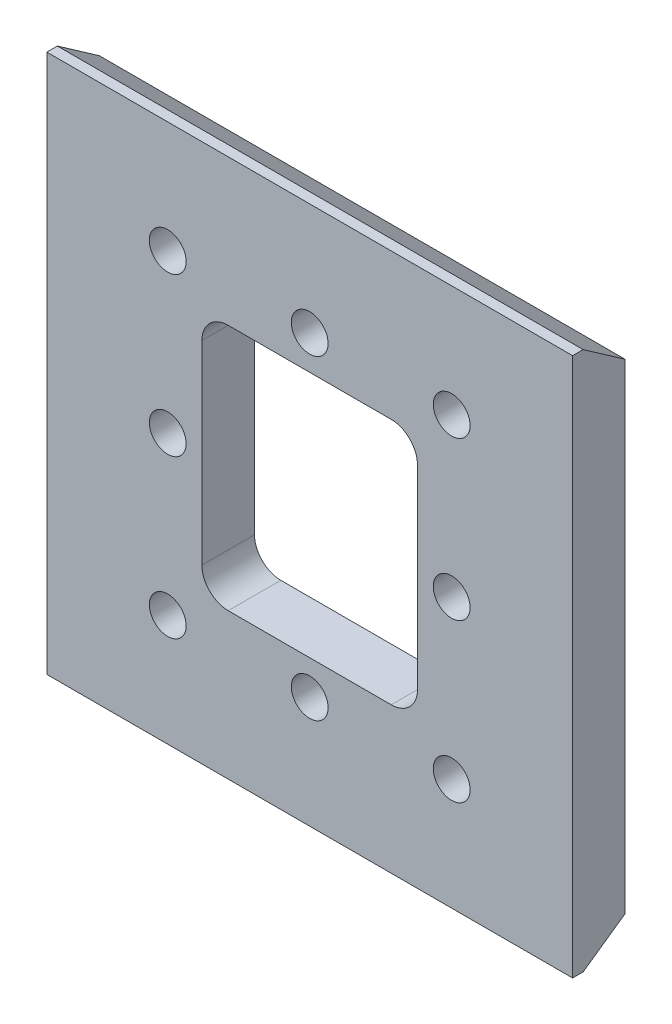
ISO-10303-21;
HEADER;
FILE_DESCRIPTION(('STEP AP214'),'2;1');
FILE_NAME('part.step','',(''),(''),'','','');
FILE_SCHEMA(('AUTOMOTIVE_DESIGN { 1 0 10303 214 1 1 1 1 }'));
ENDSEC;
DATA;
#1=APPLICATION_CONTEXT('core data for automotive mechanical design processes');
#2=APPLICATION_PROTOCOL_DEFINITION('international standard','automotive_design',2000,#1);
#3=PRODUCT_CONTEXT('',#1,'mechanical');
#4=PRODUCT('Part','Part','',(#3));
#5=PRODUCT_RELATED_PRODUCT_CATEGORY('part','',(#4));
#6=PRODUCT_DEFINITION_FORMATION('','',#4);
#7=PRODUCT_DEFINITION_CONTEXT('part definition',#1,'design');
#8=PRODUCT_DEFINITION('design','',#6,#7);
#9=PRODUCT_DEFINITION_SHAPE('','',#8);
#10=(LENGTH_UNIT() NAMED_UNIT(*) SI_UNIT(.MILLI.,.METRE.));
#11=(NAMED_UNIT(*) PLANE_ANGLE_UNIT() SI_UNIT($,.RADIAN.));
#12=(NAMED_UNIT(*) SI_UNIT($,.STERADIAN.) SOLID_ANGLE_UNIT());
#13=UNCERTAINTY_MEASURE_WITH_UNIT(LENGTH_MEASURE(1.E-05),#10,'distance_accuracy_value','');
#14=(GEOMETRIC_REPRESENTATION_CONTEXT(3) GLOBAL_UNCERTAINTY_ASSIGNED_CONTEXT((#13)) GLOBAL_UNIT_ASSIGNED_CONTEXT((#10,
#11,#12)) REPRESENTATION_CONTEXT('',''));
#15=CARTESIAN_POINT('',(0.,0.,0.));
#16=DIRECTION('',(0.,0.,1.));
#17=DIRECTION('',(1.,0.,0.));
#18=AXIS2_PLACEMENT_3D('',#15,#16,#17);
#19=CARTESIAN_POINT('',(100.,102.5,20.));
#20=DIRECTION('',(-1.,0.,0.));
#21=DIRECTION('',(0.,-1.,0.));
#22=AXIS2_PLACEMENT_3D('',#19,#20,#21);
#23=PLANE('',#22);
#24=DIRECTION('',(0.,0.,-1.));
#25=VECTOR('',#24,1.);
#26=CARTESIAN_POINT('',(100.,-102.5,20.));
#27=LINE('',#26,#25);
#28=CARTESIAN_POINT('',(100.,-102.5,20.));
#29=VERTEX_POINT('',#28);
#30=CARTESIAN_POINT('',(100.,-102.5,16.));
#31=VERTEX_POINT('',#30);
#32=EDGE_CURVE('E146',#29,#31,#27,.T.);
#33=ORIENTED_EDGE('',*,*,#32,.T.);
#34=DIRECTION('',(0.,0.573576436351042,-0.819152044288995));
#35=VECTOR('',#34,1.);
#36=CARTESIAN_POINT('',(100.,-102.5,16.));
#37=LINE('',#36,#35);
#38=CARTESIAN_POINT('',(100.,-91.2966793886447,0.));
#39=VERTEX_POINT('',#38);
#40=EDGE_CURVE('E134',#31,#39,#37,.T.);
#41=ORIENTED_EDGE('',*,*,#40,.T.);
#42=DIRECTION('',(0.,1.,0.));
#43=VECTOR('',#42,1.);
#44=CARTESIAN_POINT('',(100.,102.5,0.));
#45=LINE('',#44,#43);
#46=CARTESIAN_POINT('',(100.,91.2966793886448,0.));
#47=VERTEX_POINT('',#46);
#48=EDGE_CURVE('E57',#39,#47,#45,.T.);
#49=ORIENTED_EDGE('',*,*,#48,.T.);
#50=DIRECTION('',(0.,0.573576436351042,0.819152044288995));
#51=VECTOR('',#50,1.);
#52=CARTESIAN_POINT('',(100.,91.2966793886448,0.));
#53=LINE('',#52,#51);
#54=CARTESIAN_POINT('',(100.,102.5,16.));
#55=VERTEX_POINT('',#54);
#56=EDGE_CURVE('E183',#47,#55,#53,.T.);
#57=ORIENTED_EDGE('',*,*,#56,.T.);
#58=DIRECTION('',(0.,0.,-1.));
#59=VECTOR('',#58,1.);
#60=CARTESIAN_POINT('',(100.,102.5,20.));
#61=LINE('',#60,#59);
#62=CARTESIAN_POINT('',(100.,102.5,20.));
#63=VERTEX_POINT('',#62);
#64=EDGE_CURVE('E11',#63,#55,#61,.T.);
#65=ORIENTED_EDGE('',*,*,#64,.F.);
#66=DIRECTION('',(0.,1.,0.));
#67=VECTOR('',#66,1.);
#68=CARTESIAN_POINT('',(100.,102.5,20.));
#69=LINE('',#68,#67);
#70=EDGE_CURVE('E153',#29,#63,#69,.T.);
#71=ORIENTED_EDGE('',*,*,#70,.F.);
#72=EDGE_LOOP('',(#33,#41,#49,#57,#65,#71));
#73=FACE_BOUND('',#72,.T.);
#74=ADVANCED_FACE('F35',(#73),#23,.F.);
#75=CARTESIAN_POINT('',(-100.,102.5,20.));
#76=DIRECTION('',(0.,-1.,0.));
#77=DIRECTION('',(0.,0.,-1.));
#78=AXIS2_PLACEMENT_3D('',#75,#76,#77);
#79=PLANE('',#78);
#80=ORIENTED_EDGE('',*,*,#64,.T.);
#81=DIRECTION('',(-1.,0.,0.));
#82=VECTOR('',#81,1.);
#83=CARTESIAN_POINT('',(100.,102.5,16.));
#84=LINE('',#83,#82);
#85=CARTESIAN_POINT('',(-100.,102.5,16.));
#86=VERTEX_POINT('',#85);
#87=EDGE_CURVE('E175',#55,#86,#84,.T.);
#88=ORIENTED_EDGE('',*,*,#87,.T.);
#89=DIRECTION('',(0.,0.,-1.));
#90=VECTOR('',#89,1.);
#91=CARTESIAN_POINT('',(-100.,102.5,20.));
#92=LINE('',#91,#90);
#93=CARTESIAN_POINT('',(-100.,102.5,20.));
#94=VERTEX_POINT('',#93);
#95=EDGE_CURVE('E42',#94,#86,#92,.T.);
#96=ORIENTED_EDGE('',*,*,#95,.F.);
#97=DIRECTION('',(-1.,0.,0.));
#98=VECTOR('',#97,1.);
#99=CARTESIAN_POINT('',(-100.,102.5,20.));
#100=LINE('',#99,#98);
#101=EDGE_CURVE('E174',#63,#94,#100,.T.);
#102=ORIENTED_EDGE('',*,*,#101,.F.);
#103=EDGE_LOOP('',(#80,#88,#96,#102));
#104=FACE_BOUND('',#103,.T.);
#105=ADVANCED_FACE('F173',(#104),#79,.F.);
#106=CARTESIAN_POINT('',(-100.,102.5,20.));
#107=DIRECTION('',(1.,0.,0.));
#108=DIRECTION('',(0.,1.,0.));
#109=AXIS2_PLACEMENT_3D('',#106,#107,#108);
#110=PLANE('',#109);
#111=DIRECTION('',(0.,-1.,0.));
#112=VECTOR('',#111,1.);
#113=CARTESIAN_POINT('',(-100.,102.5,0.));
#114=LINE('',#113,#112);
#115=CARTESIAN_POINT('',(-100.,91.2966793886447,0.));
#116=VERTEX_POINT('',#115);
#117=CARTESIAN_POINT('',(-100.,-91.2966793886447,0.));
#118=VERTEX_POINT('',#117);
#119=EDGE_CURVE('E160',#116,#118,#114,.T.);
#120=ORIENTED_EDGE('',*,*,#119,.T.);
#121=DIRECTION('',(0.,0.573576436351042,-0.819152044288995));
#122=VECTOR('',#121,1.);
#123=CARTESIAN_POINT('',(-100.,-102.5,16.));
#124=LINE('',#123,#122);
#125=CARTESIAN_POINT('',(-100.,-102.5,16.));
#126=VERTEX_POINT('',#125);
#127=EDGE_CURVE('E49',#126,#118,#124,.T.);
#128=ORIENTED_EDGE('',*,*,#127,.F.);
#129=DIRECTION('',(0.,0.,-1.));
#130=VECTOR('',#129,1.);
#131=CARTESIAN_POINT('',(-100.,-102.5,20.));
#132=LINE('',#131,#130);
#133=CARTESIAN_POINT('',(-100.,-102.5,20.));
#134=VERTEX_POINT('',#133);
#135=EDGE_CURVE('E149',#134,#126,#132,.T.);
#136=ORIENTED_EDGE('',*,*,#135,.F.);
#137=DIRECTION('',(0.,-1.,0.));
#138=VECTOR('',#137,1.);
#139=CARTESIAN_POINT('',(-100.,102.5,20.));
#140=LINE('',#139,#138);
#141=EDGE_CURVE('E157',#94,#134,#140,.T.);
#142=ORIENTED_EDGE('',*,*,#141,.F.);
#143=ORIENTED_EDGE('',*,*,#95,.T.);
#144=DIRECTION('',(0.,0.573576436351042,0.819152044288995));
#145=VECTOR('',#144,1.);
#146=CARTESIAN_POINT('',(-100.,91.2966793886447,0.));
#147=LINE('',#146,#145);
#148=EDGE_CURVE('E169',#116,#86,#147,.T.);
#149=ORIENTED_EDGE('',*,*,#148,.F.);
#150=EDGE_LOOP('',(#120,#128,#136,#142,#143,#149));
#151=FACE_BOUND('',#150,.T.);
#152=ADVANCED_FACE('F168',(#151),#110,.F.);
#153=CARTESIAN_POINT('',(-100.,-102.5,20.));
#154=DIRECTION('',(0.,1.,0.));
#155=DIRECTION('',(0.,0.,1.));
#156=AXIS2_PLACEMENT_3D('',#153,#154,#155);
#157=PLANE('',#156);
#158=ORIENTED_EDGE('',*,*,#135,.T.);
#159=DIRECTION('',(-1.,0.,0.));
#160=VECTOR('',#159,1.);
#161=CARTESIAN_POINT('',(100.,-102.5,16.));
#162=LINE('',#161,#160);
#163=EDGE_CURVE('E137',#31,#126,#162,.T.);
#164=ORIENTED_EDGE('',*,*,#163,.F.);
#165=ORIENTED_EDGE('',*,*,#32,.F.);
#166=DIRECTION('',(1.,0.,0.));
#167=VECTOR('',#166,1.);
#168=CARTESIAN_POINT('',(-100.,-102.5,20.));
#169=LINE('',#168,#167);
#170=EDGE_CURVE('E154',#134,#29,#169,.T.);
#171=ORIENTED_EDGE('',*,*,#170,.F.);
#172=EDGE_LOOP('',(#158,#164,#165,#171));
#173=FACE_BOUND('',#172,.T.);
#174=ADVANCED_FACE('F144',(#173),#157,.F.);
#175=CARTESIAN_POINT('',(0.,0.,20.));
#176=DIRECTION('',(0.,0.,1.));
#177=DIRECTION('',(1.,0.,0.));
#178=AXIS2_PLACEMENT_3D('',#175,#176,#177);
#179=PLANE('',#178);
#180=CARTESIAN_POINT('',(54.,60.,20.));
#181=DIRECTION('',(0.,0.,1.));
#182=DIRECTION('',(-1.,0.,0.));
#183=AXIS2_PLACEMENT_3D('',#180,#181,#182);
#184=CIRCLE('',#183,7.);
#185=CARTESIAN_POINT('',(47.,60.,20.));
#186=VERTEX_POINT('',#185);
#187=EDGE_CURVE('E201',#186,#186,#184,.T.);
#188=ORIENTED_EDGE('',*,*,#187,.F.);
#189=EDGE_LOOP('',(#188));
#190=FACE_BOUND('',#189,.T.);
#191=CARTESIAN_POINT('',(-54.,-60.,20.));
#192=DIRECTION('',(0.,0.,1.));
#193=DIRECTION('',(-1.,0.,0.));
#194=AXIS2_PLACEMENT_3D('',#191,#192,#193);
#195=CIRCLE('',#194,7.);
#196=CARTESIAN_POINT('',(-61.,-60.,20.));
#197=VERTEX_POINT('',#196);
#198=EDGE_CURVE('E191',#197,#197,#195,.T.);
#199=ORIENTED_EDGE('',*,*,#198,.F.);
#200=EDGE_LOOP('',(#199));
#201=FACE_BOUND('',#200,.T.);
#202=CARTESIAN_POINT('',(0.,-60.,20.));
#203=DIRECTION('',(0.,0.,1.));
#204=DIRECTION('',(-1.,0.,0.));
#205=AXIS2_PLACEMENT_3D('',#202,#203,#204);
#206=CIRCLE('',#205,7.);
#207=CARTESIAN_POINT('',(-7.,-60.,20.));
#208=VERTEX_POINT('',#207);
#209=EDGE_CURVE('E192',#208,#208,#206,.T.);
#210=ORIENTED_EDGE('',*,*,#209,.F.);
#211=EDGE_LOOP('',(#210));
#212=FACE_BOUND('',#211,.T.);
#213=CARTESIAN_POINT('',(54.,-60.,20.));
#214=DIRECTION('',(0.,0.,1.));
#215=DIRECTION('',(1.,0.,0.));
#216=AXIS2_PLACEMENT_3D('',#213,#214,#215);
#217=CIRCLE('',#216,7.);
#218=CARTESIAN_POINT('',(61.,-60.,20.));
#219=VERTEX_POINT('',#218);
#220=EDGE_CURVE('E177',#219,#219,#217,.T.);
#221=ORIENTED_EDGE('',*,*,#220,.F.);
#222=EDGE_LOOP('',(#221));
#223=FACE_BOUND('',#222,.T.);
#224=CARTESIAN_POINT('',(0.,60.,20.));
#225=DIRECTION('',(0.,0.,1.));
#226=DIRECTION('',(1.,0.,0.));
#227=AXIS2_PLACEMENT_3D('',#224,#225,#226);
#228=CIRCLE('',#227,7.);
#229=CARTESIAN_POINT('',(7.,60.,20.));
#230=VERTEX_POINT('',#229);
#231=EDGE_CURVE('E225',#230,#230,#228,.T.);
#232=ORIENTED_EDGE('',*,*,#231,.F.);
#233=EDGE_LOOP('',(#232));
#234=FACE_BOUND('',#233,.T.);
#235=CARTESIAN_POINT('',(-31.,-37.,20.));
#236=DIRECTION('',(0.,0.,1.));
#237=DIRECTION('',(1.,0.,0.));
#238=AXIS2_PLACEMENT_3D('',#235,#236,#237);
#239=CIRCLE('',#238,10.);
#240=CARTESIAN_POINT('',(-41.,-36.9999999999999,20.));
#241=VERTEX_POINT('',#240);
#242=CARTESIAN_POINT('',(-30.9999999999999,-47.,20.));
#243=VERTEX_POINT('',#242);
#244=EDGE_CURVE('E212',#241,#243,#239,.T.);
#245=ORIENTED_EDGE('',*,*,#244,.F.);
#246=DIRECTION('',(0.,-1.,0.));
#247=VECTOR('',#246,1.);
#248=CARTESIAN_POINT('',(-41.,36.9999999999999,20.));
#249=LINE('',#248,#247);
#250=CARTESIAN_POINT('',(-41.,36.9999999999999,20.));
#251=VERTEX_POINT('',#250);
#252=EDGE_CURVE('E233',#251,#241,#249,.T.);
#253=ORIENTED_EDGE('',*,*,#252,.F.);
#254=CARTESIAN_POINT('',(-31.,37.,20.));
#255=DIRECTION('',(0.,0.,1.));
#256=DIRECTION('',(1.,0.,0.));
#257=AXIS2_PLACEMENT_3D('',#254,#255,#256);
#258=CIRCLE('',#257,10.);
#259=CARTESIAN_POINT('',(-30.9999999999999,47.,20.));
#260=VERTEX_POINT('',#259);
#261=EDGE_CURVE('E271',#260,#251,#258,.T.);
#262=ORIENTED_EDGE('',*,*,#261,.F.);
#263=DIRECTION('',(-1.,0.,0.));
#264=VECTOR('',#263,1.);
#265=CARTESIAN_POINT('',(-30.9999999999999,47.,20.));
#266=LINE('',#265,#264);
#267=CARTESIAN_POINT('',(30.9999999999999,47.,20.));
#268=VERTEX_POINT('',#267);
#269=EDGE_CURVE('E268',#268,#260,#266,.T.);
#270=ORIENTED_EDGE('',*,*,#269,.F.);
#271=CARTESIAN_POINT('',(31.,37.,20.));
#272=DIRECTION('',(0.,0.,1.));
#273=DIRECTION('',(-1.,0.,0.));
#274=AXIS2_PLACEMENT_3D('',#271,#272,#273);
#275=CIRCLE('',#274,10.);
#276=CARTESIAN_POINT('',(41.,36.9999999999999,20.));
#277=VERTEX_POINT('',#276);
#278=EDGE_CURVE('E265',#277,#268,#275,.T.);
#279=ORIENTED_EDGE('',*,*,#278,.F.);
#280=DIRECTION('',(0.,1.,0.));
#281=VECTOR('',#280,1.);
#282=CARTESIAN_POINT('',(41.,36.9999999999999,20.));
#283=LINE('',#282,#281);
#284=CARTESIAN_POINT('',(41.,-36.9999999999999,20.));
#285=VERTEX_POINT('',#284);
#286=EDGE_CURVE('E262',#285,#277,#283,.T.);
#287=ORIENTED_EDGE('',*,*,#286,.F.);
#288=CARTESIAN_POINT('',(31.,-37.,20.));
#289=DIRECTION('',(0.,0.,1.));
#290=DIRECTION('',(1.,0.,0.));
#291=AXIS2_PLACEMENT_3D('',#288,#289,#290);
#292=CIRCLE('',#291,10.);
#293=CARTESIAN_POINT('',(30.9999999999999,-47.,20.));
#294=VERTEX_POINT('',#293);
#295=EDGE_CURVE('E259',#294,#285,#292,.T.);
#296=ORIENTED_EDGE('',*,*,#295,.F.);
#297=DIRECTION('',(1.,0.,0.));
#298=VECTOR('',#297,1.);
#299=CARTESIAN_POINT('',(-30.9999999999999,-47.,20.));
#300=LINE('',#299,#298);
#301=EDGE_CURVE('E256',#243,#294,#300,.T.);
#302=ORIENTED_EDGE('',*,*,#301,.F.);
#303=EDGE_LOOP('',(#245,#253,#262,#270,#279,#287,#296,#302));
#304=FACE_BOUND('',#303,.T.);
#305=CARTESIAN_POINT('',(-54.,0.,20.));
#306=DIRECTION('',(0.,0.,1.));
#307=DIRECTION('',(1.,0.,0.));
#308=AXIS2_PLACEMENT_3D('',#305,#306,#307);
#309=CIRCLE('',#308,7.);
#310=CARTESIAN_POINT('',(-47.,0.,20.));
#311=VERTEX_POINT('',#310);
#312=EDGE_CURVE('E213',#311,#311,#309,.T.);
#313=ORIENTED_EDGE('',*,*,#312,.F.);
#314=EDGE_LOOP('',(#313));
#315=FACE_BOUND('',#314,.T.);
#316=CARTESIAN_POINT('',(54.,0.,20.));
#317=DIRECTION('',(0.,0.,1.));
#318=DIRECTION('',(-1.,0.,0.));
#319=AXIS2_PLACEMENT_3D('',#316,#317,#318);
#320=CIRCLE('',#319,7.);
#321=CARTESIAN_POINT('',(47.,0.,20.));
#322=VERTEX_POINT('',#321);
#323=EDGE_CURVE('E200',#322,#322,#320,.T.);
#324=ORIENTED_EDGE('',*,*,#323,.F.);
#325=EDGE_LOOP('',(#324));
#326=FACE_BOUND('',#325,.T.);
#327=CARTESIAN_POINT('',(-54.,60.,20.));
#328=DIRECTION('',(0.,0.,1.));
#329=DIRECTION('',(1.,0.,0.));
#330=AXIS2_PLACEMENT_3D('',#327,#328,#329);
#331=CIRCLE('',#330,7.);
#332=CARTESIAN_POINT('',(-47.,60.,20.));
#333=VERTEX_POINT('',#332);
#334=EDGE_CURVE('E224',#333,#333,#331,.T.);
#335=ORIENTED_EDGE('',*,*,#334,.F.);
#336=EDGE_LOOP('',(#335));
#337=FACE_BOUND('',#336,.T.);
#338=ORIENTED_EDGE('',*,*,#70,.T.);
#339=ORIENTED_EDGE('',*,*,#101,.T.);
#340=ORIENTED_EDGE('',*,*,#141,.T.);
#341=ORIENTED_EDGE('',*,*,#170,.T.);
#342=EDGE_LOOP('',(#338,#339,#340,#341));
#343=FACE_BOUND('',#342,.T.);
#344=ADVANCED_FACE('F327',(#190,#201,#212,#223,#234,#304,#315,#326,#337,#343),#179,.T.);
#345=CARTESIAN_POINT('',(0.,0.,0.));
#346=DIRECTION('',(0.,0.,1.));
#347=DIRECTION('',(1.,0.,0.));
#348=AXIS2_PLACEMENT_3D('',#345,#346,#347);
#349=PLANE('',#348);
#350=CARTESIAN_POINT('',(54.,60.,0.));
#351=DIRECTION('',(0.,0.,1.));
#352=DIRECTION('',(-1.,0.,0.));
#353=AXIS2_PLACEMENT_3D('',#350,#351,#352);
#354=CIRCLE('',#353,7.);
#355=CARTESIAN_POINT('',(47.,60.,0.));
#356=VERTEX_POINT('',#355);
#357=EDGE_CURVE('E197',#356,#356,#354,.T.);
#358=ORIENTED_EDGE('',*,*,#357,.T.);
#359=EDGE_LOOP('',(#358));
#360=FACE_BOUND('',#359,.T.);
#361=CARTESIAN_POINT('',(-54.,-60.,0.));
#362=DIRECTION('',(0.,0.,1.));
#363=DIRECTION('',(-1.,0.,0.));
#364=AXIS2_PLACEMENT_3D('',#361,#362,#363);
#365=CIRCLE('',#364,7.);
#366=CARTESIAN_POINT('',(-61.,-60.,0.));
#367=VERTEX_POINT('',#366);
#368=EDGE_CURVE('E204',#367,#367,#365,.T.);
#369=ORIENTED_EDGE('',*,*,#368,.T.);
#370=EDGE_LOOP('',(#369));
#371=FACE_BOUND('',#370,.T.);
#372=CARTESIAN_POINT('',(0.,-60.,0.));
#373=DIRECTION('',(0.,0.,1.));
#374=DIRECTION('',(-1.,0.,0.));
#375=AXIS2_PLACEMENT_3D('',#372,#373,#374);
#376=CIRCLE('',#375,7.);
#377=CARTESIAN_POINT('',(-7.,-60.,0.));
#378=VERTEX_POINT('',#377);
#379=EDGE_CURVE('E188',#378,#378,#376,.T.);
#380=ORIENTED_EDGE('',*,*,#379,.T.);
#381=EDGE_LOOP('',(#380));
#382=FACE_BOUND('',#381,.T.);
#383=CARTESIAN_POINT('',(54.,-60.,0.));
#384=DIRECTION('',(0.,0.,1.));
#385=DIRECTION('',(1.,0.,0.));
#386=AXIS2_PLACEMENT_3D('',#383,#384,#385);
#387=CIRCLE('',#386,7.);
#388=CARTESIAN_POINT('',(61.,-60.,0.));
#389=VERTEX_POINT('',#388);
#390=EDGE_CURVE('E181',#389,#389,#387,.T.);
#391=ORIENTED_EDGE('',*,*,#390,.T.);
#392=EDGE_LOOP('',(#391));
#393=FACE_BOUND('',#392,.T.);
#394=CARTESIAN_POINT('',(0.,60.,0.));
#395=DIRECTION('',(0.,0.,1.));
#396=DIRECTION('',(1.,0.,0.));
#397=AXIS2_PLACEMENT_3D('',#394,#395,#396);
#398=CIRCLE('',#397,7.);
#399=CARTESIAN_POINT('',(7.,60.,0.));
#400=VERTEX_POINT('',#399);
#401=EDGE_CURVE('E221',#400,#400,#398,.T.);
#402=ORIENTED_EDGE('',*,*,#401,.T.);
#403=EDGE_LOOP('',(#402));
#404=FACE_BOUND('',#403,.T.);
#405=DIRECTION('',(0.,-1.,0.));
#406=VECTOR('',#405,1.);
#407=CARTESIAN_POINT('',(-41.,36.9999999999999,0.));
#408=LINE('',#407,#406);
#409=CARTESIAN_POINT('',(-41.,36.9999999999999,0.));
#410=VERTEX_POINT('',#409);
#411=CARTESIAN_POINT('',(-41.,-36.9999999999999,0.));
#412=VERTEX_POINT('',#411);
#413=EDGE_CURVE('E251',#410,#412,#408,.T.);
#414=ORIENTED_EDGE('',*,*,#413,.T.);
#415=CARTESIAN_POINT('',(-31.,-37.,0.));
#416=DIRECTION('',(0.,0.,1.));
#417=DIRECTION('',(1.,0.,0.));
#418=AXIS2_PLACEMENT_3D('',#415,#416,#417);
#419=CIRCLE('',#418,10.);
#420=CARTESIAN_POINT('',(-30.9999999999999,-47.,0.));
#421=VERTEX_POINT('',#420);
#422=EDGE_CURVE('E229',#412,#421,#419,.T.);
#423=ORIENTED_EDGE('',*,*,#422,.T.);
#424=DIRECTION('',(1.,0.,0.));
#425=VECTOR('',#424,1.);
#426=CARTESIAN_POINT('',(-30.9999999999999,-47.,0.));
#427=LINE('',#426,#425);
#428=CARTESIAN_POINT('',(30.9999999999999,-47.,0.));
#429=VERTEX_POINT('',#428);
#430=EDGE_CURVE('E232',#421,#429,#427,.T.);
#431=ORIENTED_EDGE('',*,*,#430,.T.);
#432=CARTESIAN_POINT('',(31.,-37.,0.));
#433=DIRECTION('',(0.,0.,1.));
#434=DIRECTION('',(1.,0.,0.));
#435=AXIS2_PLACEMENT_3D('',#432,#433,#434);
#436=CIRCLE('',#435,10.);
#437=CARTESIAN_POINT('',(41.,-36.9999999999999,0.));
#438=VERTEX_POINT('',#437);
#439=EDGE_CURVE('E236',#429,#438,#436,.T.);
#440=ORIENTED_EDGE('',*,*,#439,.T.);
#441=DIRECTION('',(0.,1.,0.));
#442=VECTOR('',#441,1.);
#443=CARTESIAN_POINT('',(41.,36.9999999999999,0.));
#444=LINE('',#443,#442);
#445=CARTESIAN_POINT('',(41.,36.9999999999999,0.));
#446=VERTEX_POINT('',#445);
#447=EDGE_CURVE('E239',#438,#446,#444,.T.);
#448=ORIENTED_EDGE('',*,*,#447,.T.);
#449=CARTESIAN_POINT('',(31.,37.,0.));
#450=DIRECTION('',(0.,0.,1.));
#451=DIRECTION('',(-1.,0.,0.));
#452=AXIS2_PLACEMENT_3D('',#449,#450,#451);
#453=CIRCLE('',#452,10.);
#454=CARTESIAN_POINT('',(30.9999999999999,47.,0.));
#455=VERTEX_POINT('',#454);
#456=EDGE_CURVE('E242',#446,#455,#453,.T.);
#457=ORIENTED_EDGE('',*,*,#456,.T.);
#458=DIRECTION('',(-1.,0.,0.));
#459=VECTOR('',#458,1.);
#460=CARTESIAN_POINT('',(-30.9999999999999,47.,0.));
#461=LINE('',#460,#459);
#462=CARTESIAN_POINT('',(-30.9999999999999,47.,0.));
#463=VERTEX_POINT('',#462);
#464=EDGE_CURVE('E245',#455,#463,#461,.T.);
#465=ORIENTED_EDGE('',*,*,#464,.T.);
#466=CARTESIAN_POINT('',(-31.,37.,0.));
#467=DIRECTION('',(0.,0.,1.));
#468=DIRECTION('',(1.,0.,0.));
#469=AXIS2_PLACEMENT_3D('',#466,#467,#468);
#470=CIRCLE('',#469,10.);
#471=EDGE_CURVE('E248',#463,#410,#470,.T.);
#472=ORIENTED_EDGE('',*,*,#471,.T.);
#473=EDGE_LOOP('',(#414,#423,#431,#440,#448,#457,#465,#472));
#474=FACE_BOUND('',#473,.T.);
#475=CARTESIAN_POINT('',(-54.,0.,0.));
#476=DIRECTION('',(0.,0.,1.));
#477=DIRECTION('',(1.,0.,0.));
#478=AXIS2_PLACEMENT_3D('',#475,#476,#477);
#479=CIRCLE('',#478,7.);
#480=CARTESIAN_POINT('',(-47.,0.,0.));
#481=VERTEX_POINT('',#480);
#482=EDGE_CURVE('E209',#481,#481,#479,.T.);
#483=ORIENTED_EDGE('',*,*,#482,.T.);
#484=EDGE_LOOP('',(#483));
#485=FACE_BOUND('',#484,.T.);
#486=CARTESIAN_POINT('',(54.,0.,0.));
#487=DIRECTION('',(0.,0.,1.));
#488=DIRECTION('',(-1.,0.,0.));
#489=AXIS2_PLACEMENT_3D('',#486,#487,#488);
#490=CIRCLE('',#489,7.);
#491=CARTESIAN_POINT('',(47.,0.,0.));
#492=VERTEX_POINT('',#491);
#493=EDGE_CURVE('E216',#492,#492,#490,.T.);
#494=ORIENTED_EDGE('',*,*,#493,.T.);
#495=EDGE_LOOP('',(#494));
#496=FACE_BOUND('',#495,.T.);
#497=CARTESIAN_POINT('',(-54.,60.,0.));
#498=DIRECTION('',(0.,0.,1.));
#499=DIRECTION('',(1.,0.,0.));
#500=AXIS2_PLACEMENT_3D('',#497,#498,#499);
#501=CIRCLE('',#500,7.);
#502=CARTESIAN_POINT('',(-47.,60.,0.));
#503=VERTEX_POINT('',#502);
#504=EDGE_CURVE('E291',#503,#503,#501,.T.);
#505=ORIENTED_EDGE('',*,*,#504,.T.);
#506=EDGE_LOOP('',(#505));
#507=FACE_BOUND('',#506,.T.);
#508=ORIENTED_EDGE('',*,*,#48,.F.);
#509=DIRECTION('',(-1.,0.,0.));
#510=VECTOR('',#509,1.);
#511=CARTESIAN_POINT('',(100.,-91.2966793886447,0.));
#512=LINE('',#511,#510);
#513=EDGE_CURVE('E138',#39,#118,#512,.T.);
#514=ORIENTED_EDGE('',*,*,#513,.T.);
#515=ORIENTED_EDGE('',*,*,#119,.F.);
#516=DIRECTION('',(-1.,0.,0.));
#517=VECTOR('',#516,1.);
#518=CARTESIAN_POINT('',(100.,91.2966793886448,0.));
#519=LINE('',#518,#517);
#520=EDGE_CURVE('E178',#47,#116,#519,.T.);
#521=ORIENTED_EDGE('',*,*,#520,.F.);
#522=EDGE_LOOP('',(#508,#514,#515,#521));
#523=FACE_BOUND('',#522,.T.);
#524=ADVANCED_FACE('F300',(#360,#371,#382,#393,#404,#474,#485,#496,#507,#523),#349,.F.);
#525=CARTESIAN_POINT('',(-54.,60.,0.));
#526=DIRECTION('',(0.,0.,1.));
#527=DIRECTION('',(1.,0.,0.));
#528=AXIS2_PLACEMENT_3D('',#525,#526,#527);
#529=CYLINDRICAL_SURFACE('',#528,7.);
#530=ORIENTED_EDGE('',*,*,#504,.F.);
#531=EDGE_LOOP('',(#530));
#532=FACE_BOUND('',#531,.T.);
#533=ORIENTED_EDGE('',*,*,#334,.T.);
#534=EDGE_LOOP('',(#533));
#535=FACE_BOUND('',#534,.T.);
#536=ADVANCED_FACE('F330',(#532,#535),#529,.F.);
#537=CARTESIAN_POINT('',(54.,0.,0.));
#538=DIRECTION('',(0.,0.,1.));
#539=DIRECTION('',(1.,0.,0.));
#540=AXIS2_PLACEMENT_3D('',#537,#538,#539);
#541=CYLINDRICAL_SURFACE('',#540,7.);
#542=ORIENTED_EDGE('',*,*,#493,.F.);
#543=EDGE_LOOP('',(#542));
#544=FACE_BOUND('',#543,.T.);
#545=ORIENTED_EDGE('',*,*,#323,.T.);
#546=EDGE_LOOP('',(#545));
#547=FACE_BOUND('',#546,.T.);
#548=ADVANCED_FACE('F337',(#544,#547),#541,.F.);
#549=CARTESIAN_POINT('',(-54.,0.,0.));
#550=DIRECTION('',(0.,0.,1.));
#551=DIRECTION('',(1.,0.,0.));
#552=AXIS2_PLACEMENT_3D('',#549,#550,#551);
#553=CYLINDRICAL_SURFACE('',#552,7.);
#554=ORIENTED_EDGE('',*,*,#482,.F.);
#555=EDGE_LOOP('',(#554));
#556=FACE_BOUND('',#555,.T.);
#557=ORIENTED_EDGE('',*,*,#312,.T.);
#558=EDGE_LOOP('',(#557));
#559=FACE_BOUND('',#558,.T.);
#560=ADVANCED_FACE('F343',(#556,#559),#553,.F.);
#561=CARTESIAN_POINT('',(-31.,-37.,0.));
#562=DIRECTION('',(0.,0.,1.));
#563=DIRECTION('',(1.,0.,0.));
#564=AXIS2_PLACEMENT_3D('',#561,#562,#563);
#565=CYLINDRICAL_SURFACE('',#564,10.);
#566=ORIENTED_EDGE('',*,*,#244,.T.);
#567=DIRECTION('',(0.,0.,1.));
#568=VECTOR('',#567,1.);
#569=CARTESIAN_POINT('',(-30.9999999999999,-47.,0.));
#570=LINE('',#569,#568);
#571=EDGE_CURVE('E254',#421,#243,#570,.T.);
#572=ORIENTED_EDGE('',*,*,#571,.F.);
#573=ORIENTED_EDGE('',*,*,#422,.F.);
#574=DIRECTION('',(0.,0.,1.));
#575=VECTOR('',#574,1.);
#576=CARTESIAN_POINT('',(-41.,-36.9999999999999,0.));
#577=LINE('',#576,#575);
#578=EDGE_CURVE('E228',#412,#241,#577,.T.);
#579=ORIENTED_EDGE('',*,*,#578,.T.);
#580=EDGE_LOOP('',(#566,#572,#573,#579));
#581=FACE_BOUND('',#580,.T.);
#582=ADVANCED_FACE('F339',(#581),#565,.F.);
#583=CARTESIAN_POINT('',(-41.,36.9999999999999,0.));
#584=DIRECTION('',(-1.,0.,0.));
#585=DIRECTION('',(0.,-1.,0.));
#586=AXIS2_PLACEMENT_3D('',#583,#584,#585);
#587=PLANE('',#586);
#588=ORIENTED_EDGE('',*,*,#252,.T.);
#589=ORIENTED_EDGE('',*,*,#578,.F.);
#590=ORIENTED_EDGE('',*,*,#413,.F.);
#591=DIRECTION('',(0.,0.,1.));
#592=VECTOR('',#591,1.);
#593=CARTESIAN_POINT('',(-41.,36.9999999999999,0.));
#594=LINE('',#593,#592);
#595=EDGE_CURVE('E277',#410,#251,#594,.T.);
#596=ORIENTED_EDGE('',*,*,#595,.T.);
#597=EDGE_LOOP('',(#588,#589,#590,#596));
#598=FACE_BOUND('',#597,.T.);
#599=ADVANCED_FACE('F342',(#598),#587,.F.);
#600=CARTESIAN_POINT('',(-31.,37.,0.));
#601=DIRECTION('',(0.,0.,1.));
#602=DIRECTION('',(1.,0.,0.));
#603=AXIS2_PLACEMENT_3D('',#600,#601,#602);
#604=CYLINDRICAL_SURFACE('',#603,10.);
#605=ORIENTED_EDGE('',*,*,#261,.T.);
#606=ORIENTED_EDGE('',*,*,#595,.F.);
#607=ORIENTED_EDGE('',*,*,#471,.F.);
#608=DIRECTION('',(0.,0.,1.));
#609=VECTOR('',#608,1.);
#610=CARTESIAN_POINT('',(-30.9999999999999,47.,0.));
#611=LINE('',#610,#609);
#612=EDGE_CURVE('E279',#463,#260,#611,.T.);
#613=ORIENTED_EDGE('',*,*,#612,.T.);
#614=EDGE_LOOP('',(#605,#606,#607,#613));
#615=FACE_BOUND('',#614,.T.);
#616=ADVANCED_FACE('F365',(#615),#604,.F.);
#617=CARTESIAN_POINT('',(-30.9999999999999,47.,0.));
#618=DIRECTION('',(0.,1.,0.));
#619=DIRECTION('',(0.,0.,1.));
#620=AXIS2_PLACEMENT_3D('',#617,#618,#619);
#621=PLANE('',#620);
#622=ORIENTED_EDGE('',*,*,#269,.T.);
#623=ORIENTED_EDGE('',*,*,#612,.F.);
#624=ORIENTED_EDGE('',*,*,#464,.F.);
#625=DIRECTION('',(0.,0.,1.));
#626=VECTOR('',#625,1.);
#627=CARTESIAN_POINT('',(30.9999999999999,47.,0.));
#628=LINE('',#627,#626);
#629=EDGE_CURVE('E281',#455,#268,#628,.T.);
#630=ORIENTED_EDGE('',*,*,#629,.T.);
#631=EDGE_LOOP('',(#622,#623,#624,#630));
#632=FACE_BOUND('',#631,.T.);
#633=ADVANCED_FACE('F361',(#632),#621,.F.);
#634=CARTESIAN_POINT('',(31.,37.,0.));
#635=DIRECTION('',(0.,0.,1.));
#636=DIRECTION('',(1.,0.,0.));
#637=AXIS2_PLACEMENT_3D('',#634,#635,#636);
#638=CYLINDRICAL_SURFACE('',#637,10.);
#639=ORIENTED_EDGE('',*,*,#278,.T.);
#640=ORIENTED_EDGE('',*,*,#629,.F.);
#641=ORIENTED_EDGE('',*,*,#456,.F.);
#642=DIRECTION('',(0.,0.,1.));
#643=VECTOR('',#642,1.);
#644=CARTESIAN_POINT('',(41.,36.9999999999999,0.));
#645=LINE('',#644,#643);
#646=EDGE_CURVE('E283',#446,#277,#645,.T.);
#647=ORIENTED_EDGE('',*,*,#646,.T.);
#648=EDGE_LOOP('',(#639,#640,#641,#647));
#649=FACE_BOUND('',#648,.T.);
#650=ADVANCED_FACE('F357',(#649),#638,.F.);
#651=CARTESIAN_POINT('',(41.,36.9999999999999,0.));
#652=DIRECTION('',(1.,0.,0.));
#653=DIRECTION('',(0.,1.,0.));
#654=AXIS2_PLACEMENT_3D('',#651,#652,#653);
#655=PLANE('',#654);
#656=ORIENTED_EDGE('',*,*,#286,.T.);
#657=ORIENTED_EDGE('',*,*,#646,.F.);
#658=ORIENTED_EDGE('',*,*,#447,.F.);
#659=DIRECTION('',(0.,0.,1.));
#660=VECTOR('',#659,1.);
#661=CARTESIAN_POINT('',(41.,-36.9999999999999,0.));
#662=LINE('',#661,#660);
#663=EDGE_CURVE('E285',#438,#285,#662,.T.);
#664=ORIENTED_EDGE('',*,*,#663,.T.);
#665=EDGE_LOOP('',(#656,#657,#658,#664));
#666=FACE_BOUND('',#665,.T.);
#667=ADVANCED_FACE('F353',(#666),#655,.F.);
#668=CARTESIAN_POINT('',(31.,-37.,0.));
#669=DIRECTION('',(0.,0.,1.));
#670=DIRECTION('',(1.,0.,0.));
#671=AXIS2_PLACEMENT_3D('',#668,#669,#670);
#672=CYLINDRICAL_SURFACE('',#671,10.);
#673=ORIENTED_EDGE('',*,*,#295,.T.);
#674=ORIENTED_EDGE('',*,*,#663,.F.);
#675=ORIENTED_EDGE('',*,*,#439,.F.);
#676=DIRECTION('',(0.,0.,1.));
#677=VECTOR('',#676,1.);
#678=CARTESIAN_POINT('',(30.9999999999999,-47.,0.));
#679=LINE('',#678,#677);
#680=EDGE_CURVE('E287',#429,#294,#679,.T.);
#681=ORIENTED_EDGE('',*,*,#680,.T.);
#682=EDGE_LOOP('',(#673,#674,#675,#681));
#683=FACE_BOUND('',#682,.T.);
#684=ADVANCED_FACE('F349',(#683),#672,.F.);
#685=CARTESIAN_POINT('',(-30.9999999999999,-47.,0.));
#686=DIRECTION('',(0.,-1.,0.));
#687=DIRECTION('',(0.,0.,-1.));
#688=AXIS2_PLACEMENT_3D('',#685,#686,#687);
#689=PLANE('',#688);
#690=ORIENTED_EDGE('',*,*,#301,.T.);
#691=ORIENTED_EDGE('',*,*,#680,.F.);
#692=ORIENTED_EDGE('',*,*,#430,.F.);
#693=ORIENTED_EDGE('',*,*,#571,.T.);
#694=EDGE_LOOP('',(#690,#691,#692,#693));
#695=FACE_BOUND('',#694,.T.);
#696=ADVANCED_FACE('F345',(#695),#689,.F.);
#697=CARTESIAN_POINT('',(0.,60.,0.));
#698=DIRECTION('',(0.,0.,1.));
#699=DIRECTION('',(1.,0.,0.));
#700=AXIS2_PLACEMENT_3D('',#697,#698,#699);
#701=CYLINDRICAL_SURFACE('',#700,7.);
#702=ORIENTED_EDGE('',*,*,#401,.F.);
#703=EDGE_LOOP('',(#702));
#704=FACE_BOUND('',#703,.T.);
#705=ORIENTED_EDGE('',*,*,#231,.T.);
#706=EDGE_LOOP('',(#705));
#707=FACE_BOUND('',#706,.T.);
#708=ADVANCED_FACE('F348',(#704,#707),#701,.F.);
#709=CARTESIAN_POINT('',(54.,-60.,0.));
#710=DIRECTION('',(0.,0.,1.));
#711=DIRECTION('',(1.,0.,0.));
#712=AXIS2_PLACEMENT_3D('',#709,#710,#711);
#713=CYLINDRICAL_SURFACE('',#712,7.);
#714=ORIENTED_EDGE('',*,*,#390,.F.);
#715=EDGE_LOOP('',(#714));
#716=FACE_BOUND('',#715,.T.);
#717=ORIENTED_EDGE('',*,*,#220,.T.);
#718=EDGE_LOOP('',(#717));
#719=FACE_BOUND('',#718,.T.);
#720=ADVANCED_FACE('F375',(#716,#719),#713,.F.);
#721=CARTESIAN_POINT('',(0.,-60.,0.));
#722=DIRECTION('',(0.,0.,1.));
#723=DIRECTION('',(1.,0.,0.));
#724=AXIS2_PLACEMENT_3D('',#721,#722,#723);
#725=CYLINDRICAL_SURFACE('',#724,7.);
#726=ORIENTED_EDGE('',*,*,#379,.F.);
#727=EDGE_LOOP('',(#726));
#728=FACE_BOUND('',#727,.T.);
#729=ORIENTED_EDGE('',*,*,#209,.T.);
#730=EDGE_LOOP('',(#729));
#731=FACE_BOUND('',#730,.T.);
#732=ADVANCED_FACE('F384',(#728,#731),#725,.F.);
#733=CARTESIAN_POINT('',(-54.,-60.,0.));
#734=DIRECTION('',(0.,0.,1.));
#735=DIRECTION('',(1.,0.,0.));
#736=AXIS2_PLACEMENT_3D('',#733,#734,#735);
#737=CYLINDRICAL_SURFACE('',#736,7.);
#738=ORIENTED_EDGE('',*,*,#368,.F.);
#739=EDGE_LOOP('',(#738));
#740=FACE_BOUND('',#739,.T.);
#741=ORIENTED_EDGE('',*,*,#198,.T.);
#742=EDGE_LOOP('',(#741));
#743=FACE_BOUND('',#742,.T.);
#744=ADVANCED_FACE('F312',(#740,#743),#737,.F.);
#745=CARTESIAN_POINT('',(54.,60.,0.));
#746=DIRECTION('',(0.,0.,1.));
#747=DIRECTION('',(1.,0.,0.));
#748=AXIS2_PLACEMENT_3D('',#745,#746,#747);
#749=CYLINDRICAL_SURFACE('',#748,7.);
#750=ORIENTED_EDGE('',*,*,#357,.F.);
#751=EDGE_LOOP('',(#750));
#752=FACE_BOUND('',#751,.T.);
#753=ORIENTED_EDGE('',*,*,#187,.T.);
#754=EDGE_LOOP('',(#753));
#755=FACE_BOUND('',#754,.T.);
#756=ADVANCED_FACE('F305',(#752,#755),#749,.F.);
#757=CARTESIAN_POINT('',(100.,91.2966793886448,0.));
#758=DIRECTION('',(0.,-0.819152044288995,0.573576436351042));
#759=DIRECTION('',(0.,-0.573576436351042,-0.819152044288995));
#760=AXIS2_PLACEMENT_3D('',#757,#758,#759);
#761=PLANE('',#760);
#762=ORIENTED_EDGE('',*,*,#148,.T.);
#763=ORIENTED_EDGE('',*,*,#87,.F.);
#764=ORIENTED_EDGE('',*,*,#56,.F.);
#765=ORIENTED_EDGE('',*,*,#520,.T.);
#766=EDGE_LOOP('',(#762,#763,#764,#765));
#767=FACE_BOUND('',#766,.T.);
#768=ADVANCED_FACE('F303',(#767),#761,.F.);
#769=CARTESIAN_POINT('',(100.,-102.5,16.));
#770=DIRECTION('',(0.,0.819152044288995,0.573576436351042));
#771=DIRECTION('',(0.,-0.573576436351042,0.819152044288995));
#772=AXIS2_PLACEMENT_3D('',#769,#770,#771);
#773=PLANE('',#772);
#774=ORIENTED_EDGE('',*,*,#127,.T.);
#775=ORIENTED_EDGE('',*,*,#513,.F.);
#776=ORIENTED_EDGE('',*,*,#40,.F.);
#777=ORIENTED_EDGE('',*,*,#163,.T.);
#778=EDGE_LOOP('',(#774,#775,#776,#777));
#779=FACE_BOUND('',#778,.T.);
#780=ADVANCED_FACE('F136',(#779),#773,.F.);
#781=CLOSED_SHELL('',(#74,#105,#152,#174,#344,#524,#536,#548,#560,#582,#599,#616,#633,#650,#667,
#684,#696,#708,#720,#732,#744,#756,#768,#780));
#782=MANIFOLD_SOLID_BREP('B2',#781);
#783=ADVANCED_BREP_SHAPE_REPRESENTATION('',(#18,#782),#14);
#784=SHAPE_DEFINITION_REPRESENTATION(#9,#783);
ENDSEC;
END-ISO-10303-21;
